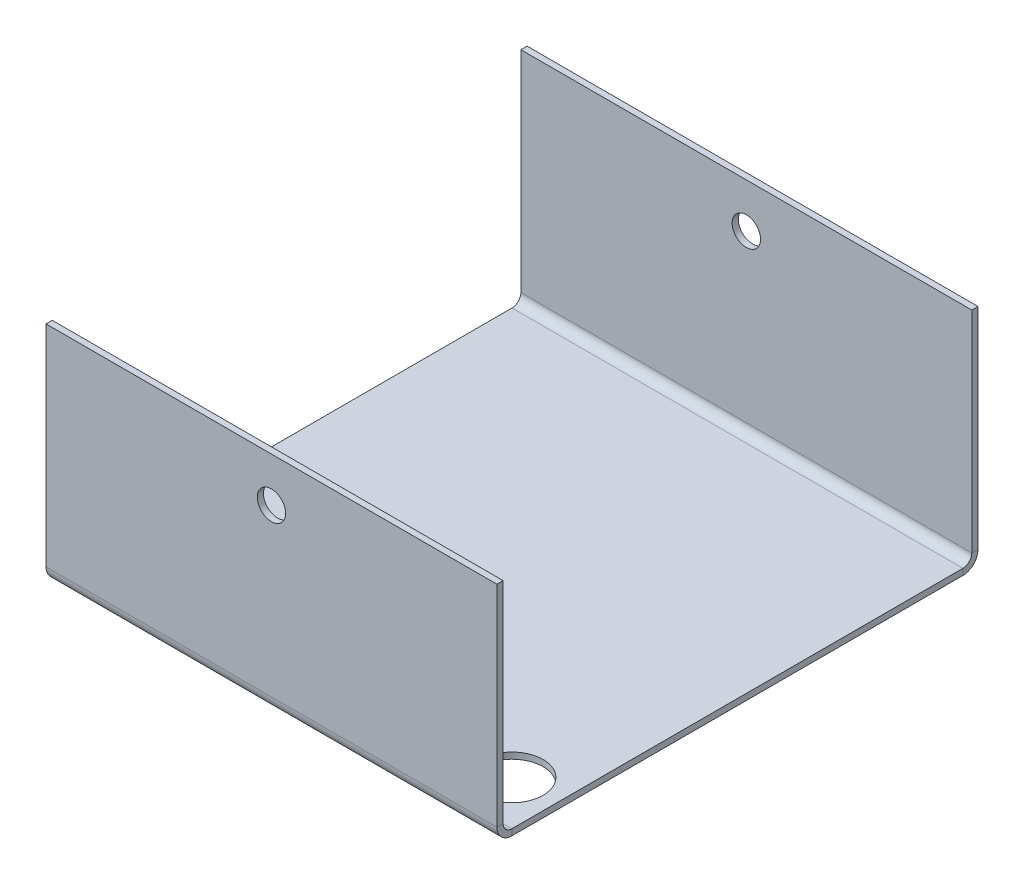
ISO-10303-21;
HEADER;
FILE_DESCRIPTION(('STEP AP214'),'2;1');
FILE_NAME('part.step','',(''),(''),'','','');
FILE_SCHEMA(('AUTOMOTIVE_DESIGN { 1 0 10303 214 1 1 1 1 }'));
ENDSEC;
DATA;
#1=APPLICATION_CONTEXT('core data for automotive mechanical design processes');
#2=APPLICATION_PROTOCOL_DEFINITION('international standard','automotive_design',2000,#1);
#3=PRODUCT_CONTEXT('',#1,'mechanical');
#4=PRODUCT('Part','Part','',(#3));
#5=PRODUCT_RELATED_PRODUCT_CATEGORY('part','',(#4));
#6=PRODUCT_DEFINITION_FORMATION('','',#4);
#7=PRODUCT_DEFINITION_CONTEXT('part definition',#1,'design');
#8=PRODUCT_DEFINITION('design','',#6,#7);
#9=PRODUCT_DEFINITION_SHAPE('','',#8);
#10=(LENGTH_UNIT() NAMED_UNIT(*) SI_UNIT(.MILLI.,.METRE.));
#11=(NAMED_UNIT(*) PLANE_ANGLE_UNIT() SI_UNIT($,.RADIAN.));
#12=(NAMED_UNIT(*) SI_UNIT($,.STERADIAN.) SOLID_ANGLE_UNIT());
#13=UNCERTAINTY_MEASURE_WITH_UNIT(LENGTH_MEASURE(1.E-05),#10,'distance_accuracy_value','');
#14=(GEOMETRIC_REPRESENTATION_CONTEXT(3) GLOBAL_UNCERTAINTY_ASSIGNED_CONTEXT((#13)) GLOBAL_UNIT_ASSIGNED_CONTEXT((#10,
#11,#12)) REPRESENTATION_CONTEXT('',''));
#15=CARTESIAN_POINT('',(0.,0.,0.));
#16=DIRECTION('',(0.,0.,1.));
#17=DIRECTION('',(1.,0.,0.));
#18=AXIS2_PLACEMENT_3D('',#15,#16,#17);
#19=CARTESIAN_POINT('',(25.4,-0.7,25.4));
#20=DIRECTION('',(1.,0.,0.));
#21=DIRECTION('',(0.,0.,-1.));
#22=AXIS2_PLACEMENT_3D('',#19,#20,#21);
#23=PLANE('',#22);
#24=DIRECTION('',(0.,0.,-1.));
#25=VECTOR('',#24,1.);
#26=CARTESIAN_POINT('',(25.4,0.,25.4));
#27=LINE('',#26,#25);
#28=CARTESIAN_POINT('',(25.4,0.,25.4));
#29=VERTEX_POINT('',#28);
#30=CARTESIAN_POINT('',(25.4,0.,-25.4));
#31=VERTEX_POINT('',#30);
#32=EDGE_CURVE('E114',#29,#31,#27,.T.);
#33=ORIENTED_EDGE('',*,*,#32,.F.);
#34=DIRECTION('',(0.,1.,0.));
#35=VECTOR('',#34,1.);
#36=CARTESIAN_POINT('',(25.4,-0.7,25.4));
#37=LINE('',#36,#35);
#38=CARTESIAN_POINT('',(25.4,-0.7,25.4));
#39=VERTEX_POINT('',#38);
#40=EDGE_CURVE('E13',#39,#29,#37,.T.);
#41=ORIENTED_EDGE('',*,*,#40,.F.);
#42=DIRECTION('',(0.,0.,-1.));
#43=VECTOR('',#42,1.);
#44=CARTESIAN_POINT('',(25.4,-0.7,25.4));
#45=LINE('',#44,#43);
#46=CARTESIAN_POINT('',(25.4,-0.7,-25.4));
#47=VERTEX_POINT('',#46);
#48=EDGE_CURVE('E135',#39,#47,#45,.T.);
#49=ORIENTED_EDGE('',*,*,#48,.T.);
#50=DIRECTION('',(0.,1.,0.));
#51=VECTOR('',#50,1.);
#52=CARTESIAN_POINT('',(25.4,-0.7,-25.4));
#53=LINE('',#52,#51);
#54=EDGE_CURVE('E120',#47,#31,#53,.T.);
#55=ORIENTED_EDGE('',*,*,#54,.T.);
#56=EDGE_LOOP('',(#33,#41,#49,#55));
#57=FACE_BOUND('',#56,.T.);
#58=ADVANCED_FACE('F77',(#57),#23,.T.);
#59=CARTESIAN_POINT('',(-25.4,-0.7,25.4));
#60=DIRECTION('',(-1.,0.,0.));
#61=DIRECTION('',(0.,0.,1.));
#62=AXIS2_PLACEMENT_3D('',#59,#60,#61);
#63=PLANE('',#62);
#64=DIRECTION('',(0.,0.,1.));
#65=VECTOR('',#64,1.);
#66=CARTESIAN_POINT('',(-25.4,0.,25.4));
#67=LINE('',#66,#65);
#68=CARTESIAN_POINT('',(-25.4,0.,-25.4));
#69=VERTEX_POINT('',#68);
#70=CARTESIAN_POINT('',(-25.4,0.,25.4));
#71=VERTEX_POINT('',#70);
#72=EDGE_CURVE('E130',#69,#71,#67,.T.);
#73=ORIENTED_EDGE('',*,*,#72,.F.);
#74=DIRECTION('',(0.,1.,0.));
#75=VECTOR('',#74,1.);
#76=CARTESIAN_POINT('',(-25.4,-0.7,-25.4));
#77=LINE('',#76,#75);
#78=CARTESIAN_POINT('',(-25.4,-0.700000000000011,-25.4));
#79=VERTEX_POINT('',#78);
#80=EDGE_CURVE('E218',#79,#69,#77,.T.);
#81=ORIENTED_EDGE('',*,*,#80,.F.);
#82=DIRECTION('',(0.,0.,1.));
#83=VECTOR('',#82,1.);
#84=CARTESIAN_POINT('',(-25.4,-0.7,25.4));
#85=LINE('',#84,#83);
#86=CARTESIAN_POINT('',(-25.4,-0.7,25.4));
#87=VERTEX_POINT('',#86);
#88=EDGE_CURVE('E95',#79,#87,#85,.T.);
#89=ORIENTED_EDGE('',*,*,#88,.T.);
#90=DIRECTION('',(0.,1.,0.));
#91=VECTOR('',#90,1.);
#92=CARTESIAN_POINT('',(-25.4,-0.7,25.4));
#93=LINE('',#92,#91);
#94=EDGE_CURVE('E86',#87,#71,#93,.T.);
#95=ORIENTED_EDGE('',*,*,#94,.T.);
#96=EDGE_LOOP('',(#73,#81,#89,#95));
#97=FACE_BOUND('',#96,.T.);
#98=ADVANCED_FACE('F375',(#97),#63,.T.);
#99=CARTESIAN_POINT('',(0.,-0.7,0.));
#100=DIRECTION('',(0.,-1.,0.));
#101=DIRECTION('',(0.,0.,-1.));
#102=AXIS2_PLACEMENT_3D('',#99,#100,#101);
#103=PLANE('',#102);
#104=CARTESIAN_POINT('',(1.4,-0.700000000000011,20.4));
#105=DIRECTION('',(0.,1.,0.));
#106=DIRECTION('',(0.,0.,1.));
#107=AXIS2_PLACEMENT_3D('',#104,#105,#106);
#108=CIRCLE('',#107,1.);
#109=CARTESIAN_POINT('',(1.4,-0.700000000000011,21.4));
#110=VERTEX_POINT('',#109);
#111=EDGE_CURVE('E308',#110,#110,#108,.T.);
#112=ORIENTED_EDGE('',*,*,#111,.T.);
#113=EDGE_LOOP('',(#112));
#114=FACE_BOUND('',#113,.T.);
#115=CARTESIAN_POINT('',(20.4,-0.700000000000011,20.4));
#116=DIRECTION('',(0.,1.,0.));
#117=DIRECTION('',(0.,0.,1.));
#118=AXIS2_PLACEMENT_3D('',#115,#116,#117);
#119=CIRCLE('',#118,3.5);
#120=CARTESIAN_POINT('',(20.4,-0.700000000000011,23.9));
#121=VERTEX_POINT('',#120);
#122=EDGE_CURVE('E280',#121,#121,#119,.T.);
#123=ORIENTED_EDGE('',*,*,#122,.T.);
#124=EDGE_LOOP('',(#123));
#125=FACE_BOUND('',#124,.T.);
#126=ORIENTED_EDGE('',*,*,#48,.F.);
#127=DIRECTION('',(1.,0.,0.));
#128=VECTOR('',#127,1.);
#129=CARTESIAN_POINT('',(-25.4,-0.7,25.4));
#130=LINE('',#129,#128);
#131=EDGE_CURVE('E213',#87,#39,#130,.T.);
#132=ORIENTED_EDGE('',*,*,#131,.F.);
#133=ORIENTED_EDGE('',*,*,#88,.F.);
#134=DIRECTION('',(-1.,0.,0.));
#135=VECTOR('',#134,1.);
#136=CARTESIAN_POINT('',(-25.4,-0.7,-25.4));
#137=LINE('',#136,#135);
#138=EDGE_CURVE('E209',#47,#79,#137,.T.);
#139=ORIENTED_EDGE('',*,*,#138,.F.);
#140=EDGE_LOOP('',(#126,#132,#133,#139));
#141=FACE_BOUND('',#140,.T.);
#142=ADVANCED_FACE('F263',(#114,#125,#141),#103,.T.);
#143=CARTESIAN_POINT('',(0.,0.,0.));
#144=DIRECTION('',(0.,-1.,0.));
#145=DIRECTION('',(0.,0.,-1.));
#146=AXIS2_PLACEMENT_3D('',#143,#144,#145);
#147=PLANE('',#146);
#148=CARTESIAN_POINT('',(1.4,0.,20.4));
#149=DIRECTION('',(0.,1.,0.));
#150=DIRECTION('',(0.,0.,1.));
#151=AXIS2_PLACEMENT_3D('',#148,#149,#150);
#152=CIRCLE('',#151,1.);
#153=CARTESIAN_POINT('',(1.4,0.,21.4));
#154=VERTEX_POINT('',#153);
#155=EDGE_CURVE('E311',#154,#154,#152,.T.);
#156=ORIENTED_EDGE('',*,*,#155,.F.);
#157=EDGE_LOOP('',(#156));
#158=FACE_BOUND('',#157,.T.);
#159=CARTESIAN_POINT('',(20.4,0.,20.4));
#160=DIRECTION('',(0.,1.,0.));
#161=DIRECTION('',(0.,0.,1.));
#162=AXIS2_PLACEMENT_3D('',#159,#160,#161);
#163=CIRCLE('',#162,3.5);
#164=CARTESIAN_POINT('',(20.4,0.,23.9));
#165=VERTEX_POINT('',#164);
#166=EDGE_CURVE('E305',#165,#165,#163,.T.);
#167=ORIENTED_EDGE('',*,*,#166,.F.);
#168=EDGE_LOOP('',(#167));
#169=FACE_BOUND('',#168,.T.);
#170=ORIENTED_EDGE('',*,*,#32,.T.);
#171=DIRECTION('',(-1.,0.,0.));
#172=VECTOR('',#171,1.);
#173=CARTESIAN_POINT('',(-25.4,0.,-25.4));
#174=LINE('',#173,#172);
#175=EDGE_CURVE('E124',#31,#69,#174,.T.);
#176=ORIENTED_EDGE('',*,*,#175,.T.);
#177=ORIENTED_EDGE('',*,*,#72,.T.);
#178=DIRECTION('',(1.,0.,0.));
#179=VECTOR('',#178,1.);
#180=CARTESIAN_POINT('',(-25.4,0.,25.4));
#181=LINE('',#180,#179);
#182=EDGE_CURVE('E128',#71,#29,#181,.T.);
#183=ORIENTED_EDGE('',*,*,#182,.T.);
#184=EDGE_LOOP('',(#170,#176,#177,#183));
#185=FACE_BOUND('',#184,.T.);
#186=ADVANCED_FACE('F129',(#158,#169,#185),#147,.F.);
#187=CARTESIAN_POINT('',(25.4,0.99999999999999,-25.4));
#188=DIRECTION('',(1.,0.,0.));
#189=DIRECTION('',(0.,0.,-1.));
#190=AXIS2_PLACEMENT_3D('',#187,#188,#189);
#191=PLANE('',#190);
#192=DIRECTION('',(0.,0.,1.));
#193=VECTOR('',#192,1.);
#194=CARTESIAN_POINT('',(25.4,1.,-27.1));
#195=LINE('',#194,#193);
#196=CARTESIAN_POINT('',(25.4,0.999999999999987,-26.4));
#197=VERTEX_POINT('',#196);
#198=CARTESIAN_POINT('',(25.4,0.999999999999984,-27.1));
#199=VERTEX_POINT('',#198);
#200=EDGE_CURVE('E194',#197,#199,#195,.F.);
#201=ORIENTED_EDGE('',*,*,#200,.F.);
#202=CARTESIAN_POINT('',(25.4,0.99999999999999,-25.4));
#203=DIRECTION('',(-1.,0.,0.));
#204=DIRECTION('',(0.,0.,1.));
#205=AXIS2_PLACEMENT_3D('',#202,#203,#204);
#206=CIRCLE('',#205,1.);
#207=EDGE_CURVE('E203',#31,#197,#206,.F.);
#208=ORIENTED_EDGE('',*,*,#207,.F.);
#209=ORIENTED_EDGE('',*,*,#54,.F.);
#210=CARTESIAN_POINT('',(25.4,0.99999999999999,-25.4));
#211=DIRECTION('',(-1.,0.,0.));
#212=DIRECTION('',(0.,0.,1.));
#213=AXIS2_PLACEMENT_3D('',#210,#211,#212);
#214=CIRCLE('',#213,1.7);
#215=EDGE_CURVE('E125',#47,#199,#214,.F.);
#216=ORIENTED_EDGE('',*,*,#215,.T.);
#217=EDGE_LOOP('',(#201,#208,#209,#216));
#218=FACE_BOUND('',#217,.T.);
#219=ADVANCED_FACE('F386',(#218),#191,.T.);
#220=CARTESIAN_POINT('',(-25.4,0.99999999999999,-25.4));
#221=DIRECTION('',(1.,0.,0.));
#222=DIRECTION('',(0.,0.,-1.));
#223=AXIS2_PLACEMENT_3D('',#220,#221,#222);
#224=PLANE('',#223);
#225=CARTESIAN_POINT('',(-25.4,0.99999999999999,-25.4));
#226=DIRECTION('',(-1.,0.,0.));
#227=DIRECTION('',(0.,0.,1.));
#228=AXIS2_PLACEMENT_3D('',#225,#226,#227);
#229=CIRCLE('',#228,1.);
#230=CARTESIAN_POINT('',(-25.4,0.999999999999987,-26.4));
#231=VERTEX_POINT('',#230);
#232=EDGE_CURVE('E163',#231,#69,#229,.T.);
#233=ORIENTED_EDGE('',*,*,#232,.F.);
#234=DIRECTION('',(0.,0.,1.));
#235=VECTOR('',#234,1.);
#236=CARTESIAN_POINT('',(-25.4,0.999999999999997,-26.4));
#237=LINE('',#236,#235);
#238=CARTESIAN_POINT('',(-25.4,1.,-27.1));
#239=VERTEX_POINT('',#238);
#240=EDGE_CURVE('E188',#231,#239,#237,.F.);
#241=ORIENTED_EDGE('',*,*,#240,.T.);
#242=CARTESIAN_POINT('',(-25.4,0.99999999999999,-25.4));
#243=DIRECTION('',(-1.,0.,0.));
#244=DIRECTION('',(0.,0.,1.));
#245=AXIS2_PLACEMENT_3D('',#242,#243,#244);
#246=CIRCLE('',#245,1.7);
#247=EDGE_CURVE('E200',#239,#79,#246,.T.);
#248=ORIENTED_EDGE('',*,*,#247,.T.);
#249=ORIENTED_EDGE('',*,*,#80,.T.);
#250=EDGE_LOOP('',(#233,#241,#248,#249));
#251=FACE_BOUND('',#250,.T.);
#252=ADVANCED_FACE('F222',(#251),#224,.F.);
#253=CARTESIAN_POINT('',(-25.4,0.99999999999999,-25.4));
#254=DIRECTION('',(-1.,0.,0.));
#255=DIRECTION('',(0.,0.,-1.));
#256=AXIS2_PLACEMENT_3D('',#253,#254,#255);
#257=CYLINDRICAL_SURFACE('',#256,1.7);
#258=ORIENTED_EDGE('',*,*,#138,.T.);
#259=ORIENTED_EDGE('',*,*,#247,.F.);
#260=DIRECTION('',(-1.,0.,0.));
#261=VECTOR('',#260,1.);
#262=CARTESIAN_POINT('',(25.4,1.,-27.1));
#263=LINE('',#262,#261);
#264=EDGE_CURVE('E185',#239,#199,#263,.F.);
#265=ORIENTED_EDGE('',*,*,#264,.T.);
#266=ORIENTED_EDGE('',*,*,#215,.F.);
#267=EDGE_LOOP('',(#258,#259,#265,#266));
#268=FACE_BOUND('',#267,.T.);
#269=ADVANCED_FACE('F391',(#268),#257,.T.);
#270=CARTESIAN_POINT('',(-25.4,0.99999999999999,-25.4));
#271=DIRECTION('',(-1.,0.,0.));
#272=DIRECTION('',(0.,0.,-1.));
#273=AXIS2_PLACEMENT_3D('',#270,#271,#272);
#274=CYLINDRICAL_SURFACE('',#273,1.);
#275=ORIENTED_EDGE('',*,*,#175,.F.);
#276=ORIENTED_EDGE('',*,*,#207,.T.);
#277=DIRECTION('',(-1.,0.,0.));
#278=VECTOR('',#277,1.);
#279=CARTESIAN_POINT('',(25.4,0.999999999999997,-26.4));
#280=LINE('',#279,#278);
#281=EDGE_CURVE('E191',#197,#231,#280,.T.);
#282=ORIENTED_EDGE('',*,*,#281,.T.);
#283=ORIENTED_EDGE('',*,*,#232,.T.);
#284=EDGE_LOOP('',(#275,#276,#282,#283));
#285=FACE_BOUND('',#284,.T.);
#286=ADVANCED_FACE('F227',(#285),#274,.F.);
#287=CARTESIAN_POINT('',(-25.4,24.7,-27.1000000000001));
#288=DIRECTION('',(1.,0.,0.));
#289=DIRECTION('',(0.,0.,-1.));
#290=AXIS2_PLACEMENT_3D('',#287,#288,#289);
#291=PLANE('',#290);
#292=ORIENTED_EDGE('',*,*,#240,.F.);
#293=DIRECTION('',(0.,-1.,0.));
#294=VECTOR('',#293,1.);
#295=CARTESIAN_POINT('',(-25.4,24.7,-26.4000000000001));
#296=LINE('',#295,#294);
#297=CARTESIAN_POINT('',(-25.4,24.7,-26.4000000000001));
#298=VERTEX_POINT('',#297);
#299=EDGE_CURVE('E182',#231,#298,#296,.F.);
#300=ORIENTED_EDGE('',*,*,#299,.T.);
#301=DIRECTION('',(0.,0.,1.));
#302=VECTOR('',#301,1.);
#303=CARTESIAN_POINT('',(-25.4,24.7,-27.1000000000001));
#304=LINE('',#303,#302);
#305=CARTESIAN_POINT('',(-25.4,24.7,-27.1000000000001));
#306=VERTEX_POINT('',#305);
#307=EDGE_CURVE('E160',#306,#298,#304,.T.);
#308=ORIENTED_EDGE('',*,*,#307,.F.);
#309=DIRECTION('',(0.,1.,0.));
#310=VECTOR('',#309,1.);
#311=CARTESIAN_POINT('',(-25.4,0.,-27.1));
#312=LINE('',#311,#310);
#313=EDGE_CURVE('E173',#239,#306,#312,.T.);
#314=ORIENTED_EDGE('',*,*,#313,.F.);
#315=EDGE_LOOP('',(#292,#300,#308,#314));
#316=FACE_BOUND('',#315,.T.);
#317=ADVANCED_FACE('F397',(#316),#291,.F.);
#318=CARTESIAN_POINT('',(25.4,0.,-27.1));
#319=DIRECTION('',(-1.,0.,0.));
#320=DIRECTION('',(0.,0.,1.));
#321=AXIS2_PLACEMENT_3D('',#318,#319,#320);
#322=PLANE('',#321);
#323=ORIENTED_EDGE('',*,*,#200,.T.);
#324=DIRECTION('',(0.,-1.,0.));
#325=VECTOR('',#324,1.);
#326=CARTESIAN_POINT('',(25.4,0.,-27.1));
#327=LINE('',#326,#325);
#328=CARTESIAN_POINT('',(25.4,24.7,-27.1000000000001));
#329=VERTEX_POINT('',#328);
#330=EDGE_CURVE('E167',#329,#199,#327,.T.);
#331=ORIENTED_EDGE('',*,*,#330,.F.);
#332=DIRECTION('',(0.,0.,1.));
#333=VECTOR('',#332,1.);
#334=CARTESIAN_POINT('',(25.4,24.7,-27.1000000000001));
#335=LINE('',#334,#333);
#336=CARTESIAN_POINT('',(25.4,24.7,-26.4000000000001));
#337=VERTEX_POINT('',#336);
#338=EDGE_CURVE('E164',#329,#337,#335,.T.);
#339=ORIENTED_EDGE('',*,*,#338,.T.);
#340=DIRECTION('',(0.,1.,0.));
#341=VECTOR('',#340,1.);
#342=CARTESIAN_POINT('',(25.4,0.,-26.4));
#343=LINE('',#342,#341);
#344=EDGE_CURVE('E176',#337,#197,#343,.F.);
#345=ORIENTED_EDGE('',*,*,#344,.T.);
#346=EDGE_LOOP('',(#323,#331,#339,#345));
#347=FACE_BOUND('',#346,.T.);
#348=ADVANCED_FACE('F242',(#347),#322,.F.);
#349=CARTESIAN_POINT('',(0.,0.,-27.1));
#350=DIRECTION('',(0.,0.,1.));
#351=DIRECTION('',(0.,-1.,0.));
#352=AXIS2_PLACEMENT_3D('',#349,#350,#351);
#353=PLANE('',#352);
#354=CARTESIAN_POINT('',(0.,19.7,-27.1000000000001));
#355=DIRECTION('',(0.,0.,1.));
#356=DIRECTION('',(1.,0.,0.));
#357=AXIS2_PLACEMENT_3D('',#354,#355,#356);
#358=CIRCLE('',#357,1.6);
#359=CARTESIAN_POINT('',(1.6,19.7,-27.1000000000001));
#360=VERTEX_POINT('',#359);
#361=EDGE_CURVE('E322',#360,#360,#358,.T.);
#362=ORIENTED_EDGE('',*,*,#361,.T.);
#363=EDGE_LOOP('',(#362));
#364=FACE_BOUND('',#363,.T.);
#365=ORIENTED_EDGE('',*,*,#264,.F.);
#366=ORIENTED_EDGE('',*,*,#313,.T.);
#367=DIRECTION('',(1.,0.,0.));
#368=VECTOR('',#367,1.);
#369=CARTESIAN_POINT('',(0.,24.7,-27.1000000000001));
#370=LINE('',#369,#368);
#371=EDGE_CURVE('E170',#306,#329,#370,.T.);
#372=ORIENTED_EDGE('',*,*,#371,.T.);
#373=ORIENTED_EDGE('',*,*,#330,.T.);
#374=EDGE_LOOP('',(#365,#366,#372,#373));
#375=FACE_BOUND('',#374,.T.);
#376=ADVANCED_FACE('F408',(#364,#375),#353,.F.);
#377=CARTESIAN_POINT('',(0.,0.,-26.4));
#378=DIRECTION('',(0.,0.,1.));
#379=DIRECTION('',(0.,-1.,0.));
#380=AXIS2_PLACEMENT_3D('',#377,#378,#379);
#381=PLANE('',#380);
#382=CARTESIAN_POINT('',(0.,19.7,-26.4000000000001));
#383=DIRECTION('',(0.,0.,1.));
#384=DIRECTION('',(0.,-1.,0.));
#385=AXIS2_PLACEMENT_3D('',#382,#383,#384);
#386=CIRCLE('',#385,1.6);
#387=CARTESIAN_POINT('',(0.,18.1,-26.4000000000001));
#388=VERTEX_POINT('',#387);
#389=EDGE_CURVE('E314',#388,#388,#386,.T.);
#390=ORIENTED_EDGE('',*,*,#389,.F.);
#391=EDGE_LOOP('',(#390));
#392=FACE_BOUND('',#391,.T.);
#393=ORIENTED_EDGE('',*,*,#299,.F.);
#394=ORIENTED_EDGE('',*,*,#281,.F.);
#395=ORIENTED_EDGE('',*,*,#344,.F.);
#396=DIRECTION('',(-1.,0.,0.));
#397=VECTOR('',#396,1.);
#398=CARTESIAN_POINT('',(25.4,24.7,-26.4000000000001));
#399=LINE('',#398,#397);
#400=EDGE_CURVE('E179',#298,#337,#399,.F.);
#401=ORIENTED_EDGE('',*,*,#400,.F.);
#402=EDGE_LOOP('',(#393,#394,#395,#401));
#403=FACE_BOUND('',#402,.T.);
#404=ADVANCED_FACE('F235',(#392,#403),#381,.T.);
#405=CARTESIAN_POINT('',(25.4,24.7,-27.1000000000001));
#406=DIRECTION('',(0.,-1.,0.));
#407=DIRECTION('',(0.,0.,-1.));
#408=AXIS2_PLACEMENT_3D('',#405,#406,#407);
#409=PLANE('',#408);
#410=ORIENTED_EDGE('',*,*,#400,.T.);
#411=ORIENTED_EDGE('',*,*,#338,.F.);
#412=ORIENTED_EDGE('',*,*,#371,.F.);
#413=ORIENTED_EDGE('',*,*,#307,.T.);
#414=EDGE_LOOP('',(#410,#411,#412,#413));
#415=FACE_BOUND('',#414,.T.);
#416=ADVANCED_FACE('F250',(#415),#409,.F.);
#417=CARTESIAN_POINT('',(-25.4,0.999999999999997,25.4));
#418=DIRECTION('',(-1.,0.,0.));
#419=DIRECTION('',(0.,0.,1.));
#420=AXIS2_PLACEMENT_3D('',#417,#418,#419);
#421=PLANE('',#420);
#422=DIRECTION('',(0.,0.,-1.));
#423=VECTOR('',#422,1.);
#424=CARTESIAN_POINT('',(-25.4,0.999999999999997,27.1));
#425=LINE('',#424,#423);
#426=CARTESIAN_POINT('',(-25.4,0.999999999999997,26.4));
#427=VERTEX_POINT('',#426);
#428=CARTESIAN_POINT('',(-25.4,0.999999999999997,27.1));
#429=VERTEX_POINT('',#428);
#430=EDGE_CURVE('E278',#427,#429,#425,.F.);
#431=ORIENTED_EDGE('',*,*,#430,.F.);
#432=CARTESIAN_POINT('',(-25.4,0.999999999999997,25.4));
#433=DIRECTION('',(1.,0.,0.));
#434=DIRECTION('',(0.,0.,-1.));
#435=AXIS2_PLACEMENT_3D('',#432,#433,#434);
#436=CIRCLE('',#435,0.999999999999997);
#437=EDGE_CURVE('E151',#71,#427,#436,.F.);
#438=ORIENTED_EDGE('',*,*,#437,.F.);
#439=ORIENTED_EDGE('',*,*,#94,.F.);
#440=CARTESIAN_POINT('',(-25.4,0.999999999999997,25.4));
#441=DIRECTION('',(1.,0.,0.));
#442=DIRECTION('',(0.,0.,-1.));
#443=AXIS2_PLACEMENT_3D('',#440,#441,#442);
#444=CIRCLE('',#443,1.7);
#445=EDGE_CURVE('E197',#87,#429,#444,.F.);
#446=ORIENTED_EDGE('',*,*,#445,.T.);
#447=EDGE_LOOP('',(#431,#438,#439,#446));
#448=FACE_BOUND('',#447,.T.);
#449=ADVANCED_FACE('F269',(#448),#421,.T.);
#450=CARTESIAN_POINT('',(25.4,0.999999999999997,25.4));
#451=DIRECTION('',(-1.,0.,0.));
#452=DIRECTION('',(0.,0.,1.));
#453=AXIS2_PLACEMENT_3D('',#450,#451,#452);
#454=PLANE('',#453);
#455=CARTESIAN_POINT('',(25.4,0.999999999999997,25.4));
#456=DIRECTION('',(1.,0.,0.));
#457=DIRECTION('',(0.,0.,-1.));
#458=AXIS2_PLACEMENT_3D('',#455,#456,#457);
#459=CIRCLE('',#458,0.999999999999997);
#460=CARTESIAN_POINT('',(25.4,0.999999999999997,26.4));
#461=VERTEX_POINT('',#460);
#462=EDGE_CURVE('E143',#461,#29,#459,.T.);
#463=ORIENTED_EDGE('',*,*,#462,.F.);
#464=DIRECTION('',(0.,0.,-1.));
#465=VECTOR('',#464,1.);
#466=CARTESIAN_POINT('',(25.4,0.999999999999997,26.4));
#467=LINE('',#466,#465);
#468=CARTESIAN_POINT('',(25.4,0.999999999999997,27.1));
#469=VERTEX_POINT('',#468);
#470=EDGE_CURVE('E282',#461,#469,#467,.F.);
#471=ORIENTED_EDGE('',*,*,#470,.T.);
#472=CARTESIAN_POINT('',(25.4,0.999999999999997,25.4));
#473=DIRECTION('',(1.,0.,0.));
#474=DIRECTION('',(0.,0.,-1.));
#475=AXIS2_PLACEMENT_3D('',#472,#473,#474);
#476=CIRCLE('',#475,1.7);
#477=EDGE_CURVE('E146',#469,#39,#476,.T.);
#478=ORIENTED_EDGE('',*,*,#477,.T.);
#479=ORIENTED_EDGE('',*,*,#40,.T.);
#480=EDGE_LOOP('',(#463,#471,#478,#479));
#481=FACE_BOUND('',#480,.T.);
#482=ADVANCED_FACE('F140',(#481),#454,.F.);
#483=CARTESIAN_POINT('',(25.4,0.999999999999997,25.4));
#484=DIRECTION('',(1.,0.,0.));
#485=DIRECTION('',(0.,0.,1.));
#486=AXIS2_PLACEMENT_3D('',#483,#484,#485);
#487=CYLINDRICAL_SURFACE('',#486,1.7);
#488=ORIENTED_EDGE('',*,*,#131,.T.);
#489=ORIENTED_EDGE('',*,*,#477,.F.);
#490=DIRECTION('',(1.,0.,0.));
#491=VECTOR('',#490,1.);
#492=CARTESIAN_POINT('',(-25.4,0.999999999999997,27.1));
#493=LINE('',#492,#491);
#494=EDGE_CURVE('E275',#469,#429,#493,.F.);
#495=ORIENTED_EDGE('',*,*,#494,.T.);
#496=ORIENTED_EDGE('',*,*,#445,.F.);
#497=EDGE_LOOP('',(#488,#489,#495,#496));
#498=FACE_BOUND('',#497,.T.);
#499=ADVANCED_FACE('F273',(#498),#487,.T.);
#500=CARTESIAN_POINT('',(25.4,0.999999999999997,25.4));
#501=DIRECTION('',(1.,0.,0.));
#502=DIRECTION('',(0.,0.,1.));
#503=AXIS2_PLACEMENT_3D('',#500,#501,#502);
#504=CYLINDRICAL_SURFACE('',#503,0.999999999999997);
#505=ORIENTED_EDGE('',*,*,#182,.F.);
#506=ORIENTED_EDGE('',*,*,#437,.T.);
#507=DIRECTION('',(1.,0.,0.));
#508=VECTOR('',#507,1.);
#509=CARTESIAN_POINT('',(-25.4,0.999999999999997,26.4));
#510=LINE('',#509,#508);
#511=EDGE_CURVE('E150',#427,#461,#510,.T.);
#512=ORIENTED_EDGE('',*,*,#511,.T.);
#513=ORIENTED_EDGE('',*,*,#462,.T.);
#514=EDGE_LOOP('',(#505,#506,#512,#513));
#515=FACE_BOUND('',#514,.T.);
#516=ADVANCED_FACE('F148',(#515),#504,.F.);
#517=CARTESIAN_POINT('',(-25.4,0.,27.1));
#518=DIRECTION('',(1.,0.,0.));
#519=DIRECTION('',(0.,0.,-1.));
#520=AXIS2_PLACEMENT_3D('',#517,#518,#519);
#521=PLANE('',#520);
#522=ORIENTED_EDGE('',*,*,#430,.T.);
#523=DIRECTION('',(0.,-1.,0.));
#524=VECTOR('',#523,1.);
#525=CARTESIAN_POINT('',(-25.4,0.,27.1));
#526=LINE('',#525,#524);
#527=CARTESIAN_POINT('',(-25.4,24.7,27.1));
#528=VERTEX_POINT('',#527);
#529=EDGE_CURVE('E294',#528,#429,#526,.T.);
#530=ORIENTED_EDGE('',*,*,#529,.F.);
#531=DIRECTION('',(0.,0.,-1.));
#532=VECTOR('',#531,1.);
#533=CARTESIAN_POINT('',(-25.4,24.7,27.1));
#534=LINE('',#533,#532);
#535=CARTESIAN_POINT('',(-25.4,24.7,26.4));
#536=VERTEX_POINT('',#535);
#537=EDGE_CURVE('E156',#528,#536,#534,.T.);
#538=ORIENTED_EDGE('',*,*,#537,.T.);
#539=DIRECTION('',(0.,1.,0.));
#540=VECTOR('',#539,1.);
#541=CARTESIAN_POINT('',(-25.4,0.,26.4));
#542=LINE('',#541,#540);
#543=EDGE_CURVE('E285',#536,#427,#542,.F.);
#544=ORIENTED_EDGE('',*,*,#543,.T.);
#545=EDGE_LOOP('',(#522,#530,#538,#544));
#546=FACE_BOUND('',#545,.T.);
#547=ADVANCED_FACE('F364',(#546),#521,.F.);
#548=CARTESIAN_POINT('',(25.4,24.7,27.1));
#549=DIRECTION('',(-1.,0.,0.));
#550=DIRECTION('',(0.,0.,1.));
#551=AXIS2_PLACEMENT_3D('',#548,#549,#550);
#552=PLANE('',#551);
#553=ORIENTED_EDGE('',*,*,#470,.F.);
#554=DIRECTION('',(0.,-1.,0.));
#555=VECTOR('',#554,1.);
#556=CARTESIAN_POINT('',(25.4,24.7,26.4));
#557=LINE('',#556,#555);
#558=CARTESIAN_POINT('',(25.4,24.7,26.4));
#559=VERTEX_POINT('',#558);
#560=EDGE_CURVE('E288',#461,#559,#557,.F.);
#561=ORIENTED_EDGE('',*,*,#560,.T.);
#562=DIRECTION('',(0.,0.,-1.));
#563=VECTOR('',#562,1.);
#564=CARTESIAN_POINT('',(25.4,24.7,27.1));
#565=LINE('',#564,#563);
#566=CARTESIAN_POINT('',(25.4,24.7,27.1));
#567=VERTEX_POINT('',#566);
#568=EDGE_CURVE('E152',#567,#559,#565,.T.);
#569=ORIENTED_EDGE('',*,*,#568,.F.);
#570=DIRECTION('',(0.,1.,0.));
#571=VECTOR('',#570,1.);
#572=CARTESIAN_POINT('',(25.4,0.,27.1));
#573=LINE('',#572,#571);
#574=EDGE_CURVE('E297',#469,#567,#573,.T.);
#575=ORIENTED_EDGE('',*,*,#574,.F.);
#576=EDGE_LOOP('',(#553,#561,#569,#575));
#577=FACE_BOUND('',#576,.T.);
#578=ADVANCED_FACE('F345',(#577),#552,.F.);
#579=CARTESIAN_POINT('',(0.,0.,27.1));
#580=DIRECTION('',(0.,0.,-1.));
#581=DIRECTION('',(-1.,0.,0.));
#582=AXIS2_PLACEMENT_3D('',#579,#580,#581);
#583=PLANE('',#582);
#584=CARTESIAN_POINT('',(0.,19.7,27.1));
#585=DIRECTION('',(0.,0.,1.));
#586=DIRECTION('',(1.,0.,0.));
#587=AXIS2_PLACEMENT_3D('',#584,#585,#586);
#588=CIRCLE('',#587,1.6);
#589=CARTESIAN_POINT('',(1.6,19.7,27.1));
#590=VERTEX_POINT('',#589);
#591=EDGE_CURVE('E319',#590,#590,#588,.T.);
#592=ORIENTED_EDGE('',*,*,#591,.F.);
#593=EDGE_LOOP('',(#592));
#594=FACE_BOUND('',#593,.T.);
#595=ORIENTED_EDGE('',*,*,#494,.F.);
#596=ORIENTED_EDGE('',*,*,#574,.T.);
#597=DIRECTION('',(-1.,0.,0.));
#598=VECTOR('',#597,1.);
#599=CARTESIAN_POINT('',(0.,24.7,27.1));
#600=LINE('',#599,#598);
#601=EDGE_CURVE('E300',#567,#528,#600,.T.);
#602=ORIENTED_EDGE('',*,*,#601,.T.);
#603=ORIENTED_EDGE('',*,*,#529,.T.);
#604=EDGE_LOOP('',(#595,#596,#602,#603));
#605=FACE_BOUND('',#604,.T.);
#606=ADVANCED_FACE('F336',(#594,#605),#583,.F.);
#607=CARTESIAN_POINT('',(0.,0.,26.4));
#608=DIRECTION('',(0.,0.,-1.));
#609=DIRECTION('',(-1.,0.,0.));
#610=AXIS2_PLACEMENT_3D('',#607,#608,#609);
#611=PLANE('',#610);
#612=CARTESIAN_POINT('',(0.,19.7,26.4));
#613=DIRECTION('',(0.,0.,-1.));
#614=DIRECTION('',(-1.,0.,0.));
#615=AXIS2_PLACEMENT_3D('',#612,#613,#614);
#616=CIRCLE('',#615,1.6);
#617=CARTESIAN_POINT('',(-1.6,19.7,26.4));
#618=VERTEX_POINT('',#617);
#619=EDGE_CURVE('E80',#618,#618,#616,.T.);
#620=ORIENTED_EDGE('',*,*,#619,.F.);
#621=EDGE_LOOP('',(#620));
#622=FACE_BOUND('',#621,.T.);
#623=ORIENTED_EDGE('',*,*,#560,.F.);
#624=ORIENTED_EDGE('',*,*,#511,.F.);
#625=ORIENTED_EDGE('',*,*,#543,.F.);
#626=DIRECTION('',(1.,0.,0.));
#627=VECTOR('',#626,1.);
#628=CARTESIAN_POINT('',(-25.4,24.7,26.4));
#629=LINE('',#628,#627);
#630=EDGE_CURVE('E291',#559,#536,#629,.F.);
#631=ORIENTED_EDGE('',*,*,#630,.F.);
#632=EDGE_LOOP('',(#623,#624,#625,#631));
#633=FACE_BOUND('',#632,.T.);
#634=ADVANCED_FACE('F332',(#622,#633),#611,.T.);
#635=CARTESIAN_POINT('',(-25.4,24.7,27.1));
#636=DIRECTION('',(0.,-1.,0.));
#637=DIRECTION('',(0.,0.,-1.));
#638=AXIS2_PLACEMENT_3D('',#635,#636,#637);
#639=PLANE('',#638);
#640=ORIENTED_EDGE('',*,*,#630,.T.);
#641=ORIENTED_EDGE('',*,*,#537,.F.);
#642=ORIENTED_EDGE('',*,*,#601,.F.);
#643=ORIENTED_EDGE('',*,*,#568,.T.);
#644=EDGE_LOOP('',(#640,#641,#642,#643));
#645=FACE_BOUND('',#644,.T.);
#646=ADVANCED_FACE('F335',(#645),#639,.F.);
#647=CARTESIAN_POINT('',(20.4,-0.700000000000011,20.4));
#648=DIRECTION('',(0.,1.,0.));
#649=DIRECTION('',(0.,0.,1.));
#650=AXIS2_PLACEMENT_3D('',#647,#648,#649);
#651=CYLINDRICAL_SURFACE('',#650,3.5);
#652=ORIENTED_EDGE('',*,*,#122,.F.);
#653=EDGE_LOOP('',(#652));
#654=FACE_BOUND('',#653,.T.);
#655=ORIENTED_EDGE('',*,*,#166,.T.);
#656=EDGE_LOOP('',(#655));
#657=FACE_BOUND('',#656,.T.);
#658=ADVANCED_FACE('F450',(#654,#657),#651,.F.);
#659=CARTESIAN_POINT('',(1.4,-0.700000000000011,20.4));
#660=DIRECTION('',(0.,1.,0.));
#661=DIRECTION('',(0.,0.,1.));
#662=AXIS2_PLACEMENT_3D('',#659,#660,#661);
#663=CYLINDRICAL_SURFACE('',#662,1.);
#664=ORIENTED_EDGE('',*,*,#111,.F.);
#665=EDGE_LOOP('',(#664));
#666=FACE_BOUND('',#665,.T.);
#667=ORIENTED_EDGE('',*,*,#155,.T.);
#668=EDGE_LOOP('',(#667));
#669=FACE_BOUND('',#668,.T.);
#670=ADVANCED_FACE('F461',(#666,#669),#663,.F.);
#671=CARTESIAN_POINT('',(0.,19.7,-27.1000000000001));
#672=DIRECTION('',(0.,0.,1.));
#673=DIRECTION('',(1.,0.,0.));
#674=AXIS2_PLACEMENT_3D('',#671,#672,#673);
#675=CYLINDRICAL_SURFACE('',#674,1.6);
#676=ORIENTED_EDGE('',*,*,#619,.T.);
#677=EDGE_LOOP('',(#676));
#678=FACE_BOUND('',#677,.T.);
#679=ORIENTED_EDGE('',*,*,#591,.T.);
#680=EDGE_LOOP('',(#679));
#681=FACE_BOUND('',#680,.T.);
#682=ADVANCED_FACE('F329',(#678,#681),#675,.F.);
#683=ORIENTED_EDGE('',*,*,#389,.T.);
#684=EDGE_LOOP('',(#683));
#685=FACE_BOUND('',#684,.T.);
#686=ORIENTED_EDGE('',*,*,#361,.F.);
#687=EDGE_LOOP('',(#686));
#688=FACE_BOUND('',#687,.T.);
#689=ADVANCED_FACE('F528',(#685,#688),#675,.F.);
#690=CLOSED_SHELL('',(#58,#98,#142,#186,#219,#252,#269,#286,#317,#348,#376,#404,#416,#449,#482,
#499,#516,#547,#578,#606,#634,#646,#658,#670,#682,#689));
#691=MANIFOLD_SOLID_BREP('B2',#690);
#692=ADVANCED_BREP_SHAPE_REPRESENTATION('',(#18,#691),#14);
#693=SHAPE_DEFINITION_REPRESENTATION(#9,#692);
ENDSEC;
END-ISO-10303-21;
